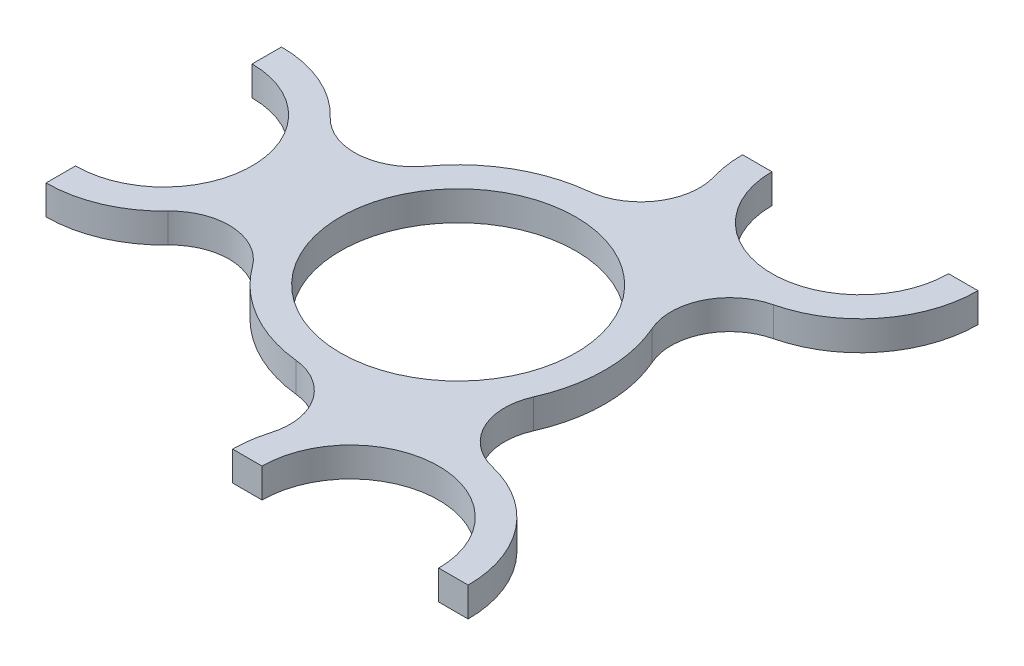
ISO-10303-21;
HEADER;
FILE_DESCRIPTION(('STEP AP214'),'2;1');
FILE_NAME('part.step','',(''),(''),'','','');
FILE_SCHEMA(('AUTOMOTIVE_DESIGN { 1 0 10303 214 1 1 1 1 }'));
ENDSEC;
DATA;
#1=APPLICATION_CONTEXT('core data for automotive mechanical design processes');
#2=APPLICATION_PROTOCOL_DEFINITION('international standard','automotive_design',2000,#1);
#3=PRODUCT_CONTEXT('',#1,'mechanical');
#4=PRODUCT('Part','Part','',(#3));
#5=PRODUCT_RELATED_PRODUCT_CATEGORY('part','',(#4));
#6=PRODUCT_DEFINITION_FORMATION('','',#4);
#7=PRODUCT_DEFINITION_CONTEXT('part definition',#1,'design');
#8=PRODUCT_DEFINITION('design','',#6,#7);
#9=PRODUCT_DEFINITION_SHAPE('','',#8);
#10=(LENGTH_UNIT() NAMED_UNIT(*) SI_UNIT(.MILLI.,.METRE.));
#11=(NAMED_UNIT(*) PLANE_ANGLE_UNIT() SI_UNIT($,.RADIAN.));
#12=(NAMED_UNIT(*) SI_UNIT($,.STERADIAN.) SOLID_ANGLE_UNIT());
#13=UNCERTAINTY_MEASURE_WITH_UNIT(LENGTH_MEASURE(1.E-05),#10,'distance_accuracy_value','');
#14=(GEOMETRIC_REPRESENTATION_CONTEXT(3) GLOBAL_UNCERTAINTY_ASSIGNED_CONTEXT((#13)) GLOBAL_UNIT_ASSIGNED_CONTEXT((#10,
#11,#12)) REPRESENTATION_CONTEXT('',''));
#15=CARTESIAN_POINT('',(0.,0.,0.));
#16=DIRECTION('',(0.,0.,1.));
#17=DIRECTION('',(1.,0.,0.));
#18=AXIS2_PLACEMENT_3D('',#15,#16,#17);
#19=CARTESIAN_POINT('',(50.,10.,-86.6));
#20=DIRECTION('',(0.,1.,0.));
#21=DIRECTION('',(0.,0.,1.));
#22=AXIS2_PLACEMENT_3D('',#19,#20,#21);
#23=PLANE('',#22);
#24=CARTESIAN_POINT('',(50.,10.,-86.6));
#25=DIRECTION('',(0.,1.,0.));
#26=DIRECTION('',(0.,0.,1.));
#27=AXIS2_PLACEMENT_3D('',#24,#25,#26);
#28=CIRCLE('',#27,40.);
#29=CARTESIAN_POINT('',(10.,10.,-86.6));
#30=VERTEX_POINT('',#29);
#31=CARTESIAN_POINT('',(11.6405543302781,10.,-75.2618816414869));
#32=VERTEX_POINT('',#31);
#33=EDGE_CURVE('E308',#30,#32,#28,.T.);
#34=ORIENTED_EDGE('',*,*,#33,.T.);
#35=CARTESIAN_POINT('',(-7.53916850458287,10.,-69.5928224622303));
#36=DIRECTION('',(0.,-1.,0.));
#37=DIRECTION('',(0.,0.,1.));
#38=AXIS2_PLACEMENT_3D('',#35,#36,#37);
#39=CIRCLE('',#38,20.);
#40=CARTESIAN_POINT('',(-5.38512036041633,10.,-49.7091589015931));
#41=VERTEX_POINT('',#40);
#42=EDGE_CURVE('E148',#32,#41,#39,.T.);
#43=ORIENTED_EDGE('',*,*,#42,.T.);
#44=CARTESIAN_POINT('',(0.,10.,0.));
#45=DIRECTION('',(0.,1.,0.));
#46=DIRECTION('',(0.,0.,1.));
#47=AXIS2_PLACEMENT_3D('',#44,#45,#46);
#48=CIRCLE('',#47,50.);
#49=CARTESIAN_POINT('',(-40.3571428571429,10.,-29.5178085299055));
#50=VERTEX_POINT('',#49);
#51=EDGE_CURVE('E393',#41,#50,#48,.T.);
#52=ORIENTED_EDGE('',*,*,#51,.T.);
#53=CARTESIAN_POINT('',(-56.5,10.,-41.3249319418677));
#54=DIRECTION('',(0.,-1.,0.));
#55=DIRECTION('',(0.,0.,1.));
#56=AXIS2_PLACEMENT_3D('',#53,#54,#55);
#57=CIRCLE('',#56,20.);
#58=CARTESIAN_POINT('',(-71.,10.,-27.5499546279118));
#59=VERTEX_POINT('',#58);
#60=EDGE_CURVE('E413',#50,#59,#57,.T.);
#61=ORIENTED_EDGE('',*,*,#60,.T.);
#62=CARTESIAN_POINT('',(-100.,10.,0.));
#63=DIRECTION('',(0.,1.,0.));
#64=DIRECTION('',(0.,0.,1.));
#65=AXIS2_PLACEMENT_3D('',#62,#63,#64);
#66=CIRCLE('',#65,40.);
#67=CARTESIAN_POINT('',(-100.,10.,-40.));
#68=VERTEX_POINT('',#67);
#69=EDGE_CURVE('E409',#59,#68,#66,.T.);
#70=ORIENTED_EDGE('',*,*,#69,.T.);
#71=DIRECTION('',(0.,0.,1.));
#72=VECTOR('',#71,1.);
#73=CARTESIAN_POINT('',(-100.,10.,-40.));
#74=LINE('',#73,#72);
#75=CARTESIAN_POINT('',(-100.,10.,-30.));
#76=VERTEX_POINT('',#75);
#77=EDGE_CURVE('E412',#68,#76,#74,.T.);
#78=ORIENTED_EDGE('',*,*,#77,.T.);
#79=CARTESIAN_POINT('',(-100.,10.,0.));
#80=DIRECTION('',(0.,-1.,0.));
#81=DIRECTION('',(0.,0.,1.));
#82=AXIS2_PLACEMENT_3D('',#79,#80,#81);
#83=CIRCLE('',#82,30.);
#84=CARTESIAN_POINT('',(-100.,10.,30.));
#85=VERTEX_POINT('',#84);
#86=EDGE_CURVE('E417',#76,#85,#83,.T.);
#87=ORIENTED_EDGE('',*,*,#86,.T.);
#88=DIRECTION('',(0.,0.,1.));
#89=VECTOR('',#88,1.);
#90=CARTESIAN_POINT('',(-100.,10.,30.));
#91=LINE('',#90,#89);
#92=CARTESIAN_POINT('',(-100.,10.,40.));
#93=VERTEX_POINT('',#92);
#94=EDGE_CURVE('E424',#85,#93,#91,.T.);
#95=ORIENTED_EDGE('',*,*,#94,.T.);
#96=CARTESIAN_POINT('',(-100.,10.,0.));
#97=DIRECTION('',(0.,1.,0.));
#98=DIRECTION('',(0.,0.,1.));
#99=AXIS2_PLACEMENT_3D('',#96,#97,#98);
#100=CIRCLE('',#99,40.);
#101=CARTESIAN_POINT('',(-71.,10.,27.5499546279118));
#102=VERTEX_POINT('',#101);
#103=EDGE_CURVE('E427',#93,#102,#100,.T.);
#104=ORIENTED_EDGE('',*,*,#103,.T.);
#105=CARTESIAN_POINT('',(-56.5,10.,41.3249319418677));
#106=DIRECTION('',(0.,-1.,0.));
#107=DIRECTION('',(0.,0.,-1.));
#108=AXIS2_PLACEMENT_3D('',#105,#106,#107);
#109=CIRCLE('',#108,20.);
#110=CARTESIAN_POINT('',(-40.3571428571428,10.,29.5178085299055));
#111=VERTEX_POINT('',#110);
#112=EDGE_CURVE('E430',#102,#111,#109,.T.);
#113=ORIENTED_EDGE('',*,*,#112,.T.);
#114=CARTESIAN_POINT('',(0.,10.,0.));
#115=DIRECTION('',(0.,1.,0.));
#116=DIRECTION('',(0.,0.,1.));
#117=AXIS2_PLACEMENT_3D('',#114,#115,#116);
#118=CIRCLE('',#117,50.);
#119=CARTESIAN_POINT('',(-5.38512036041633,10.,49.7091589015931));
#120=VERTEX_POINT('',#119);
#121=EDGE_CURVE('E433',#111,#120,#118,.T.);
#122=ORIENTED_EDGE('',*,*,#121,.T.);
#123=CARTESIAN_POINT('',(-7.53916850458286,10.,69.5928224622303));
#124=DIRECTION('',(0.,-1.,0.));
#125=DIRECTION('',(0.,0.,-1.));
#126=AXIS2_PLACEMENT_3D('',#123,#124,#125);
#127=CIRCLE('',#126,20.);
#128=CARTESIAN_POINT('',(11.6405543302781,10.,75.2618816414869));
#129=VERTEX_POINT('',#128);
#130=EDGE_CURVE('E436',#120,#129,#127,.T.);
#131=ORIENTED_EDGE('',*,*,#130,.T.);
#132=CARTESIAN_POINT('',(50.,10.,86.6));
#133=DIRECTION('',(0.,1.,0.));
#134=DIRECTION('',(0.,0.,-1.));
#135=AXIS2_PLACEMENT_3D('',#132,#133,#134);
#136=CIRCLE('',#135,40.);
#137=CARTESIAN_POINT('',(10.,10.,86.6));
#138=VERTEX_POINT('',#137);
#139=EDGE_CURVE('E439',#129,#138,#136,.T.);
#140=ORIENTED_EDGE('',*,*,#139,.T.);
#141=DIRECTION('',(1.,0.,0.));
#142=VECTOR('',#141,1.);
#143=CARTESIAN_POINT('',(10.,10.,86.6));
#144=LINE('',#143,#142);
#145=CARTESIAN_POINT('',(20.,10.,86.6));
#146=VERTEX_POINT('',#145);
#147=EDGE_CURVE('E442',#138,#146,#144,.T.);
#148=ORIENTED_EDGE('',*,*,#147,.T.);
#149=CARTESIAN_POINT('',(50.,10.,86.6));
#150=DIRECTION('',(0.,-1.,0.));
#151=DIRECTION('',(0.,0.,-1.));
#152=AXIS2_PLACEMENT_3D('',#149,#150,#151);
#153=CIRCLE('',#152,30.);
#154=CARTESIAN_POINT('',(80.,10.,86.6));
#155=VERTEX_POINT('',#154);
#156=EDGE_CURVE('E445',#146,#155,#153,.T.);
#157=ORIENTED_EDGE('',*,*,#156,.T.);
#158=DIRECTION('',(1.,0.,0.));
#159=VECTOR('',#158,1.);
#160=CARTESIAN_POINT('',(80.,10.,86.6));
#161=LINE('',#160,#159);
#162=CARTESIAN_POINT('',(90.,10.,86.6));
#163=VERTEX_POINT('',#162);
#164=EDGE_CURVE('E448',#155,#163,#161,.T.);
#165=ORIENTED_EDGE('',*,*,#164,.T.);
#166=CARTESIAN_POINT('',(50.,10.,86.6));
#167=DIRECTION('',(0.,1.,0.));
#168=DIRECTION('',(0.,0.,-1.));
#169=AXIS2_PLACEMENT_3D('',#166,#167,#168);
#170=CIRCLE('',#169,40.);
#171=CARTESIAN_POINT('',(59.3596363447783,10.,47.7104486077107));
#172=VERTEX_POINT('',#171);
#173=EDGE_CURVE('E451',#163,#172,#170,.T.);
#174=ORIENTED_EDGE('',*,*,#173,.T.);
#175=CARTESIAN_POINT('',(64.0394545171674,10.,28.2656729115661));
#176=DIRECTION('',(0.,-1.,0.));
#177=DIRECTION('',(0.,0.,-1.));
#178=AXIS2_PLACEMENT_3D('',#175,#176,#177);
#179=CIRCLE('',#178,20.);
#180=CARTESIAN_POINT('',(45.7424675122625,10.,20.1897663654044));
#181=VERTEX_POINT('',#180);
#182=EDGE_CURVE('E454',#172,#181,#179,.T.);
#183=ORIENTED_EDGE('',*,*,#182,.T.);
#184=CARTESIAN_POINT('',(0.,10.,0.));
#185=DIRECTION('',(0.,1.,0.));
#186=DIRECTION('',(0.,0.,1.));
#187=AXIS2_PLACEMENT_3D('',#184,#185,#186);
#188=CIRCLE('',#187,50.);
#189=CARTESIAN_POINT('',(45.7424675122625,10.,-20.1897663654044));
#190=VERTEX_POINT('',#189);
#191=EDGE_CURVE('E457',#181,#190,#188,.T.);
#192=ORIENTED_EDGE('',*,*,#191,.T.);
#193=CARTESIAN_POINT('',(64.0394545171674,10.,-28.2656729115661));
#194=DIRECTION('',(0.,-1.,0.));
#195=DIRECTION('',(0.,0.,1.));
#196=AXIS2_PLACEMENT_3D('',#193,#194,#195);
#197=CIRCLE('',#196,20.);
#198=CARTESIAN_POINT('',(59.3596363447783,10.,-47.7104486077108));
#199=VERTEX_POINT('',#198);
#200=EDGE_CURVE('E460',#190,#199,#197,.T.);
#201=ORIENTED_EDGE('',*,*,#200,.T.);
#202=CARTESIAN_POINT('',(50.,10.,-86.6));
#203=DIRECTION('',(0.,1.,0.));
#204=DIRECTION('',(0.,0.,1.));
#205=AXIS2_PLACEMENT_3D('',#202,#203,#204);
#206=CIRCLE('',#205,40.);
#207=CARTESIAN_POINT('',(90.,10.,-86.6));
#208=VERTEX_POINT('',#207);
#209=EDGE_CURVE('E215',#199,#208,#206,.T.);
#210=ORIENTED_EDGE('',*,*,#209,.T.);
#211=DIRECTION('',(-1.,0.,0.));
#212=VECTOR('',#211,1.);
#213=CARTESIAN_POINT('',(80.,10.,-86.6));
#214=LINE('',#213,#212);
#215=CARTESIAN_POINT('',(80.,10.,-86.6));
#216=VERTEX_POINT('',#215);
#217=EDGE_CURVE('E209',#208,#216,#214,.T.);
#218=ORIENTED_EDGE('',*,*,#217,.T.);
#219=CARTESIAN_POINT('',(50.,10.,-86.6));
#220=DIRECTION('',(0.,-1.,0.));
#221=DIRECTION('',(0.,0.,1.));
#222=AXIS2_PLACEMENT_3D('',#219,#220,#221);
#223=CIRCLE('',#222,30.);
#224=CARTESIAN_POINT('',(20.,10.,-86.6));
#225=VERTEX_POINT('',#224);
#226=EDGE_CURVE('E213',#216,#225,#223,.T.);
#227=ORIENTED_EDGE('',*,*,#226,.T.);
#228=DIRECTION('',(-1.,0.,0.));
#229=VECTOR('',#228,1.);
#230=CARTESIAN_POINT('',(10.,10.,-86.6));
#231=LINE('',#230,#229);
#232=EDGE_CURVE('E57',#225,#30,#231,.T.);
#233=ORIENTED_EDGE('',*,*,#232,.T.);
#234=EDGE_LOOP('',(#34,#43,#52,#61,#70,#78,#87,#95,#104,#113,#122,#131,#140,#148,#157,#165,#174,
#183,#192,#201,#210,#218,#227,#233));
#235=FACE_BOUND('',#234,.T.);
#236=CARTESIAN_POINT('',(0.,10.,0.));
#237=DIRECTION('',(0.,1.,0.));
#238=DIRECTION('',(0.,0.,1.));
#239=AXIS2_PLACEMENT_3D('',#236,#237,#238);
#240=CIRCLE('',#239,40.);
#241=CARTESIAN_POINT('',(0.,10.,40.));
#242=VERTEX_POINT('',#241);
#243=EDGE_CURVE('E242',#242,#242,#240,.T.);
#244=ORIENTED_EDGE('',*,*,#243,.F.);
#245=EDGE_LOOP('',(#244));
#246=FACE_BOUND('',#245,.T.);
#247=ADVANCED_FACE('F39',(#235,#246),#23,.T.);
#248=CARTESIAN_POINT('',(50.,0.,-86.6));
#249=DIRECTION('',(0.,1.,0.));
#250=DIRECTION('',(0.,0.,1.));
#251=AXIS2_PLACEMENT_3D('',#248,#249,#250);
#252=PLANE('',#251);
#253=CARTESIAN_POINT('',(50.,0.,-86.6));
#254=DIRECTION('',(0.,1.,0.));
#255=DIRECTION('',(0.,0.,1.));
#256=AXIS2_PLACEMENT_3D('',#253,#254,#255);
#257=CIRCLE('',#256,40.);
#258=CARTESIAN_POINT('',(10.,0.,-86.6));
#259=VERTEX_POINT('',#258);
#260=CARTESIAN_POINT('',(11.6405543302781,0.,-75.2618816414869));
#261=VERTEX_POINT('',#260);
#262=EDGE_CURVE('E237',#259,#261,#257,.T.);
#263=ORIENTED_EDGE('',*,*,#262,.F.);
#264=DIRECTION('',(-1.,0.,0.));
#265=VECTOR('',#264,1.);
#266=CARTESIAN_POINT('',(10.,0.,-86.6));
#267=LINE('',#266,#265);
#268=CARTESIAN_POINT('',(20.,0.,-86.6));
#269=VERTEX_POINT('',#268);
#270=EDGE_CURVE('E140',#269,#259,#267,.T.);
#271=ORIENTED_EDGE('',*,*,#270,.F.);
#272=CARTESIAN_POINT('',(50.,0.,-86.6));
#273=DIRECTION('',(0.,-1.,0.));
#274=DIRECTION('',(0.,0.,1.));
#275=AXIS2_PLACEMENT_3D('',#272,#273,#274);
#276=CIRCLE('',#275,30.);
#277=CARTESIAN_POINT('',(80.,0.,-86.6));
#278=VERTEX_POINT('',#277);
#279=EDGE_CURVE('E134',#278,#269,#276,.T.);
#280=ORIENTED_EDGE('',*,*,#279,.F.);
#281=DIRECTION('',(-1.,0.,0.));
#282=VECTOR('',#281,1.);
#283=CARTESIAN_POINT('',(80.,0.,-86.6));
#284=LINE('',#283,#282);
#285=CARTESIAN_POINT('',(90.,0.,-86.6));
#286=VERTEX_POINT('',#285);
#287=EDGE_CURVE('E224',#286,#278,#284,.T.);
#288=ORIENTED_EDGE('',*,*,#287,.F.);
#289=CARTESIAN_POINT('',(50.,0.,-86.6));
#290=DIRECTION('',(0.,1.,0.));
#291=DIRECTION('',(0.,0.,1.));
#292=AXIS2_PLACEMENT_3D('',#289,#290,#291);
#293=CIRCLE('',#292,40.);
#294=CARTESIAN_POINT('',(59.3596363447783,0.,-47.7104486077108));
#295=VERTEX_POINT('',#294);
#296=EDGE_CURVE('E299',#295,#286,#293,.T.);
#297=ORIENTED_EDGE('',*,*,#296,.F.);
#298=CARTESIAN_POINT('',(64.0394545171674,0.,-28.2656729115661));
#299=DIRECTION('',(0.,-1.,0.));
#300=DIRECTION('',(0.,0.,1.));
#301=AXIS2_PLACEMENT_3D('',#298,#299,#300);
#302=CIRCLE('',#301,20.);
#303=CARTESIAN_POINT('',(45.7424675122625,0.,-20.1897663654044));
#304=VERTEX_POINT('',#303);
#305=EDGE_CURVE('E296',#304,#295,#302,.T.);
#306=ORIENTED_EDGE('',*,*,#305,.F.);
#307=CARTESIAN_POINT('',(0.,0.,0.));
#308=DIRECTION('',(0.,1.,0.));
#309=DIRECTION('',(0.,0.,1.));
#310=AXIS2_PLACEMENT_3D('',#307,#308,#309);
#311=CIRCLE('',#310,50.);
#312=CARTESIAN_POINT('',(45.7424675122625,0.,20.1897663654044));
#313=VERTEX_POINT('',#312);
#314=EDGE_CURVE('E293',#313,#304,#311,.T.);
#315=ORIENTED_EDGE('',*,*,#314,.F.);
#316=CARTESIAN_POINT('',(64.0394545171674,0.,28.2656729115661));
#317=DIRECTION('',(0.,-1.,0.));
#318=DIRECTION('',(0.,0.,-1.));
#319=AXIS2_PLACEMENT_3D('',#316,#317,#318);
#320=CIRCLE('',#319,20.);
#321=CARTESIAN_POINT('',(59.3596363447783,0.,47.7104486077107));
#322=VERTEX_POINT('',#321);
#323=EDGE_CURVE('E290',#322,#313,#320,.T.);
#324=ORIENTED_EDGE('',*,*,#323,.F.);
#325=CARTESIAN_POINT('',(50.,0.,86.6));
#326=DIRECTION('',(0.,1.,0.));
#327=DIRECTION('',(0.,0.,-1.));
#328=AXIS2_PLACEMENT_3D('',#325,#326,#327);
#329=CIRCLE('',#328,40.);
#330=CARTESIAN_POINT('',(90.,0.,86.6));
#331=VERTEX_POINT('',#330);
#332=EDGE_CURVE('E287',#331,#322,#329,.T.);
#333=ORIENTED_EDGE('',*,*,#332,.F.);
#334=DIRECTION('',(1.,0.,0.));
#335=VECTOR('',#334,1.);
#336=CARTESIAN_POINT('',(80.,0.,86.6));
#337=LINE('',#336,#335);
#338=CARTESIAN_POINT('',(80.,0.,86.6));
#339=VERTEX_POINT('',#338);
#340=EDGE_CURVE('E284',#339,#331,#337,.T.);
#341=ORIENTED_EDGE('',*,*,#340,.F.);
#342=CARTESIAN_POINT('',(50.,0.,86.6));
#343=DIRECTION('',(0.,-1.,0.));
#344=DIRECTION('',(0.,0.,-1.));
#345=AXIS2_PLACEMENT_3D('',#342,#343,#344);
#346=CIRCLE('',#345,30.);
#347=CARTESIAN_POINT('',(20.,0.,86.6));
#348=VERTEX_POINT('',#347);
#349=EDGE_CURVE('E281',#348,#339,#346,.T.);
#350=ORIENTED_EDGE('',*,*,#349,.F.);
#351=DIRECTION('',(1.,0.,0.));
#352=VECTOR('',#351,1.);
#353=CARTESIAN_POINT('',(10.,0.,86.6));
#354=LINE('',#353,#352);
#355=CARTESIAN_POINT('',(10.,0.,86.6));
#356=VERTEX_POINT('',#355);
#357=EDGE_CURVE('E278',#356,#348,#354,.T.);
#358=ORIENTED_EDGE('',*,*,#357,.F.);
#359=CARTESIAN_POINT('',(50.,0.,86.6));
#360=DIRECTION('',(0.,1.,0.));
#361=DIRECTION('',(0.,0.,-1.));
#362=AXIS2_PLACEMENT_3D('',#359,#360,#361);
#363=CIRCLE('',#362,40.);
#364=CARTESIAN_POINT('',(11.6405543302781,0.,75.2618816414869));
#365=VERTEX_POINT('',#364);
#366=EDGE_CURVE('E275',#365,#356,#363,.T.);
#367=ORIENTED_EDGE('',*,*,#366,.F.);
#368=CARTESIAN_POINT('',(-7.53916850458286,0.,69.5928224622303));
#369=DIRECTION('',(0.,-1.,0.));
#370=DIRECTION('',(0.,0.,-1.));
#371=AXIS2_PLACEMENT_3D('',#368,#369,#370);
#372=CIRCLE('',#371,20.);
#373=CARTESIAN_POINT('',(-5.38512036041633,0.,49.7091589015931));
#374=VERTEX_POINT('',#373);
#375=EDGE_CURVE('E272',#374,#365,#372,.T.);
#376=ORIENTED_EDGE('',*,*,#375,.F.);
#377=CARTESIAN_POINT('',(0.,0.,0.));
#378=DIRECTION('',(0.,1.,0.));
#379=DIRECTION('',(0.,0.,1.));
#380=AXIS2_PLACEMENT_3D('',#377,#378,#379);
#381=CIRCLE('',#380,50.);
#382=CARTESIAN_POINT('',(-40.3571428571428,0.,29.5178085299055));
#383=VERTEX_POINT('',#382);
#384=EDGE_CURVE('E269',#383,#374,#381,.T.);
#385=ORIENTED_EDGE('',*,*,#384,.F.);
#386=CARTESIAN_POINT('',(-56.5,0.,41.3249319418677));
#387=DIRECTION('',(0.,-1.,0.));
#388=DIRECTION('',(0.,0.,-1.));
#389=AXIS2_PLACEMENT_3D('',#386,#387,#388);
#390=CIRCLE('',#389,20.);
#391=CARTESIAN_POINT('',(-71.,0.,27.5499546279118));
#392=VERTEX_POINT('',#391);
#393=EDGE_CURVE('E266',#392,#383,#390,.T.);
#394=ORIENTED_EDGE('',*,*,#393,.F.);
#395=CARTESIAN_POINT('',(-100.,0.,0.));
#396=DIRECTION('',(0.,1.,0.));
#397=DIRECTION('',(0.,0.,1.));
#398=AXIS2_PLACEMENT_3D('',#395,#396,#397);
#399=CIRCLE('',#398,40.);
#400=CARTESIAN_POINT('',(-100.,0.,40.));
#401=VERTEX_POINT('',#400);
#402=EDGE_CURVE('E263',#401,#392,#399,.T.);
#403=ORIENTED_EDGE('',*,*,#402,.F.);
#404=DIRECTION('',(0.,0.,1.));
#405=VECTOR('',#404,1.);
#406=CARTESIAN_POINT('',(-100.,0.,30.));
#407=LINE('',#406,#405);
#408=CARTESIAN_POINT('',(-100.,0.,30.));
#409=VERTEX_POINT('',#408);
#410=EDGE_CURVE('E260',#409,#401,#407,.T.);
#411=ORIENTED_EDGE('',*,*,#410,.F.);
#412=CARTESIAN_POINT('',(-100.,0.,0.));
#413=DIRECTION('',(0.,-1.,0.));
#414=DIRECTION('',(0.,0.,1.));
#415=AXIS2_PLACEMENT_3D('',#412,#413,#414);
#416=CIRCLE('',#415,30.);
#417=CARTESIAN_POINT('',(-100.,0.,-30.));
#418=VERTEX_POINT('',#417);
#419=EDGE_CURVE('E257',#418,#409,#416,.T.);
#420=ORIENTED_EDGE('',*,*,#419,.F.);
#421=DIRECTION('',(0.,0.,1.));
#422=VECTOR('',#421,1.);
#423=CARTESIAN_POINT('',(-100.,0.,-40.));
#424=LINE('',#423,#422);
#425=CARTESIAN_POINT('',(-100.,0.,-40.));
#426=VERTEX_POINT('',#425);
#427=EDGE_CURVE('E254',#426,#418,#424,.T.);
#428=ORIENTED_EDGE('',*,*,#427,.F.);
#429=CARTESIAN_POINT('',(-100.,0.,0.));
#430=DIRECTION('',(0.,1.,0.));
#431=DIRECTION('',(0.,0.,1.));
#432=AXIS2_PLACEMENT_3D('',#429,#430,#431);
#433=CIRCLE('',#432,40.);
#434=CARTESIAN_POINT('',(-71.,0.,-27.5499546279118));
#435=VERTEX_POINT('',#434);
#436=EDGE_CURVE('E251',#435,#426,#433,.T.);
#437=ORIENTED_EDGE('',*,*,#436,.F.);
#438=CARTESIAN_POINT('',(-56.5,0.,-41.3249319418677));
#439=DIRECTION('',(0.,-1.,0.));
#440=DIRECTION('',(0.,0.,1.));
#441=AXIS2_PLACEMENT_3D('',#438,#439,#440);
#442=CIRCLE('',#441,20.);
#443=CARTESIAN_POINT('',(-40.3571428571429,0.,-29.5178085299055));
#444=VERTEX_POINT('',#443);
#445=EDGE_CURVE('E248',#444,#435,#442,.T.);
#446=ORIENTED_EDGE('',*,*,#445,.F.);
#447=CARTESIAN_POINT('',(0.,0.,0.));
#448=DIRECTION('',(0.,1.,0.));
#449=DIRECTION('',(0.,0.,1.));
#450=AXIS2_PLACEMENT_3D('',#447,#448,#449);
#451=CIRCLE('',#450,50.);
#452=CARTESIAN_POINT('',(-5.38512036041633,0.,-49.7091589015931));
#453=VERTEX_POINT('',#452);
#454=EDGE_CURVE('E245',#453,#444,#451,.T.);
#455=ORIENTED_EDGE('',*,*,#454,.F.);
#456=CARTESIAN_POINT('',(-7.53916850458287,0.,-69.5928224622303));
#457=DIRECTION('',(0.,-1.,0.));
#458=DIRECTION('',(0.,0.,1.));
#459=AXIS2_PLACEMENT_3D('',#456,#457,#458);
#460=CIRCLE('',#459,20.);
#461=EDGE_CURVE('E241',#261,#453,#460,.T.);
#462=ORIENTED_EDGE('',*,*,#461,.F.);
#463=EDGE_LOOP('',(#263,#271,#280,#288,#297,#306,#315,#324,#333,#341,#350,#358,#367,#376,#385,
#394,#403,#411,#420,#428,#437,#446,#455,#462));
#464=FACE_BOUND('',#463,.T.);
#465=CARTESIAN_POINT('',(0.,0.,0.));
#466=DIRECTION('',(0.,1.,0.));
#467=DIRECTION('',(0.,0.,1.));
#468=AXIS2_PLACEMENT_3D('',#465,#466,#467);
#469=CIRCLE('',#468,40.);
#470=CARTESIAN_POINT('',(0.,0.,40.));
#471=VERTEX_POINT('',#470);
#472=EDGE_CURVE('E765',#471,#471,#469,.T.);
#473=ORIENTED_EDGE('',*,*,#472,.T.);
#474=EDGE_LOOP('',(#473));
#475=FACE_BOUND('',#474,.T.);
#476=ADVANCED_FACE('F397',(#464,#475),#252,.F.);
#477=CARTESIAN_POINT('',(50.,10.,-86.6));
#478=DIRECTION('',(0.,-1.,0.));
#479=DIRECTION('',(0.,0.,-1.));
#480=AXIS2_PLACEMENT_3D('',#477,#478,#479);
#481=CYLINDRICAL_SURFACE('',#480,40.);
#482=ORIENTED_EDGE('',*,*,#262,.T.);
#483=DIRECTION('',(0.,-1.,0.));
#484=VECTOR('',#483,1.);
#485=CARTESIAN_POINT('',(11.6405543302781,10.,-75.2618816414869));
#486=LINE('',#485,#484);
#487=EDGE_CURVE('E11',#32,#261,#486,.T.);
#488=ORIENTED_EDGE('',*,*,#487,.F.);
#489=ORIENTED_EDGE('',*,*,#33,.F.);
#490=DIRECTION('',(0.,-1.,0.));
#491=VECTOR('',#490,1.);
#492=CARTESIAN_POINT('',(10.,10.,-86.6));
#493=LINE('',#492,#491);
#494=EDGE_CURVE('E233',#30,#259,#493,.T.);
#495=ORIENTED_EDGE('',*,*,#494,.T.);
#496=EDGE_LOOP('',(#482,#488,#489,#495));
#497=FACE_BOUND('',#496,.T.);
#498=ADVANCED_FACE('F41',(#497),#481,.T.);
#499=CARTESIAN_POINT('',(-7.53916850458287,10.,-69.5928224622303));
#500=DIRECTION('',(0.,-1.,0.));
#501=DIRECTION('',(0.,0.,-1.));
#502=AXIS2_PLACEMENT_3D('',#499,#500,#501);
#503=CYLINDRICAL_SURFACE('',#502,20.);
#504=ORIENTED_EDGE('',*,*,#461,.T.);
#505=DIRECTION('',(0.,-1.,0.));
#506=VECTOR('',#505,1.);
#507=CARTESIAN_POINT('',(-5.38512036041633,10.,-49.7091589015931));
#508=LINE('',#507,#506);
#509=EDGE_CURVE('E49',#41,#453,#508,.T.);
#510=ORIENTED_EDGE('',*,*,#509,.F.);
#511=ORIENTED_EDGE('',*,*,#42,.F.);
#512=ORIENTED_EDGE('',*,*,#487,.T.);
#513=EDGE_LOOP('',(#504,#510,#511,#512));
#514=FACE_BOUND('',#513,.T.);
#515=ADVANCED_FACE('F496',(#514),#503,.F.);
#516=CARTESIAN_POINT('',(0.,10.,0.));
#517=DIRECTION('',(0.,-1.,0.));
#518=DIRECTION('',(0.,0.,-1.));
#519=AXIS2_PLACEMENT_3D('',#516,#517,#518);
#520=CYLINDRICAL_SURFACE('',#519,50.);
#521=ORIENTED_EDGE('',*,*,#454,.T.);
#522=DIRECTION('',(0.,-1.,0.));
#523=VECTOR('',#522,1.);
#524=CARTESIAN_POINT('',(-40.3571428571429,10.,-29.5178085299055));
#525=LINE('',#524,#523);
#526=EDGE_CURVE('E383',#50,#444,#525,.T.);
#527=ORIENTED_EDGE('',*,*,#526,.F.);
#528=ORIENTED_EDGE('',*,*,#51,.F.);
#529=ORIENTED_EDGE('',*,*,#509,.T.);
#530=EDGE_LOOP('',(#521,#527,#528,#529));
#531=FACE_BOUND('',#530,.T.);
#532=ADVANCED_FACE('F391',(#531),#520,.T.);
#533=CARTESIAN_POINT('',(-56.5,10.,-41.3249319418677));
#534=DIRECTION('',(0.,-1.,0.));
#535=DIRECTION('',(0.,0.,-1.));
#536=AXIS2_PLACEMENT_3D('',#533,#534,#535);
#537=CYLINDRICAL_SURFACE('',#536,20.);
#538=ORIENTED_EDGE('',*,*,#445,.T.);
#539=DIRECTION('',(0.,-1.,0.));
#540=VECTOR('',#539,1.);
#541=CARTESIAN_POINT('',(-71.,10.,-27.5499546279118));
#542=LINE('',#541,#540);
#543=EDGE_CURVE('E379',#59,#435,#542,.T.);
#544=ORIENTED_EDGE('',*,*,#543,.F.);
#545=ORIENTED_EDGE('',*,*,#60,.F.);
#546=ORIENTED_EDGE('',*,*,#526,.T.);
#547=EDGE_LOOP('',(#538,#544,#545,#546));
#548=FACE_BOUND('',#547,.T.);
#549=ADVANCED_FACE('F403',(#548),#537,.F.);
#550=CARTESIAN_POINT('',(-100.,10.,0.));
#551=DIRECTION('',(0.,-1.,0.));
#552=DIRECTION('',(0.,0.,-1.));
#553=AXIS2_PLACEMENT_3D('',#550,#551,#552);
#554=CYLINDRICAL_SURFACE('',#553,40.);
#555=ORIENTED_EDGE('',*,*,#436,.T.);
#556=DIRECTION('',(0.,-1.,0.));
#557=VECTOR('',#556,1.);
#558=CARTESIAN_POINT('',(-100.,10.,-40.));
#559=LINE('',#558,#557);
#560=EDGE_CURVE('E375',#68,#426,#559,.T.);
#561=ORIENTED_EDGE('',*,*,#560,.F.);
#562=ORIENTED_EDGE('',*,*,#69,.F.);
#563=ORIENTED_EDGE('',*,*,#543,.T.);
#564=EDGE_LOOP('',(#555,#561,#562,#563));
#565=FACE_BOUND('',#564,.T.);
#566=ADVANCED_FACE('F407',(#565),#554,.T.);
#567=CARTESIAN_POINT('',(-100.,10.,-40.));
#568=DIRECTION('',(1.,0.,0.));
#569=DIRECTION('',(0.,0.,-1.));
#570=AXIS2_PLACEMENT_3D('',#567,#568,#569);
#571=PLANE('',#570);
#572=ORIENTED_EDGE('',*,*,#427,.T.);
#573=DIRECTION('',(0.,-1.,0.));
#574=VECTOR('',#573,1.);
#575=CARTESIAN_POINT('',(-100.,10.,-30.));
#576=LINE('',#575,#574);
#577=EDGE_CURVE('E371',#76,#418,#576,.T.);
#578=ORIENTED_EDGE('',*,*,#577,.F.);
#579=ORIENTED_EDGE('',*,*,#77,.F.);
#580=ORIENTED_EDGE('',*,*,#560,.T.);
#581=EDGE_LOOP('',(#572,#578,#579,#580));
#582=FACE_BOUND('',#581,.T.);
#583=ADVANCED_FACE('F509',(#582),#571,.F.);
#584=CARTESIAN_POINT('',(-100.,10.,0.));
#585=DIRECTION('',(0.,-1.,0.));
#586=DIRECTION('',(0.,0.,-1.));
#587=AXIS2_PLACEMENT_3D('',#584,#585,#586);
#588=CYLINDRICAL_SURFACE('',#587,30.);
#589=ORIENTED_EDGE('',*,*,#419,.T.);
#590=DIRECTION('',(0.,-1.,0.));
#591=VECTOR('',#590,1.);
#592=CARTESIAN_POINT('',(-100.,10.,30.));
#593=LINE('',#592,#591);
#594=EDGE_CURVE('E367',#85,#409,#593,.T.);
#595=ORIENTED_EDGE('',*,*,#594,.F.);
#596=ORIENTED_EDGE('',*,*,#86,.F.);
#597=ORIENTED_EDGE('',*,*,#577,.T.);
#598=EDGE_LOOP('',(#589,#595,#596,#597));
#599=FACE_BOUND('',#598,.T.);
#600=ADVANCED_FACE('F512',(#599),#588,.F.);
#601=CARTESIAN_POINT('',(-100.,10.,30.));
#602=DIRECTION('',(1.,0.,0.));
#603=DIRECTION('',(0.,0.,-1.));
#604=AXIS2_PLACEMENT_3D('',#601,#602,#603);
#605=PLANE('',#604);
#606=ORIENTED_EDGE('',*,*,#410,.T.);
#607=DIRECTION('',(0.,-1.,0.));
#608=VECTOR('',#607,1.);
#609=CARTESIAN_POINT('',(-100.,10.,40.));
#610=LINE('',#609,#608);
#611=EDGE_CURVE('E363',#93,#401,#610,.T.);
#612=ORIENTED_EDGE('',*,*,#611,.F.);
#613=ORIENTED_EDGE('',*,*,#94,.F.);
#614=ORIENTED_EDGE('',*,*,#594,.T.);
#615=EDGE_LOOP('',(#606,#612,#613,#614));
#616=FACE_BOUND('',#615,.T.);
#617=ADVANCED_FACE('F516',(#616),#605,.F.);
#618=CARTESIAN_POINT('',(-100.,10.,0.));
#619=DIRECTION('',(0.,-1.,0.));
#620=DIRECTION('',(0.,0.,-1.));
#621=AXIS2_PLACEMENT_3D('',#618,#619,#620);
#622=CYLINDRICAL_SURFACE('',#621,40.);
#623=ORIENTED_EDGE('',*,*,#402,.T.);
#624=DIRECTION('',(0.,-1.,0.));
#625=VECTOR('',#624,1.);
#626=CARTESIAN_POINT('',(-71.,10.,27.5499546279118));
#627=LINE('',#626,#625);
#628=EDGE_CURVE('E359',#102,#392,#627,.T.);
#629=ORIENTED_EDGE('',*,*,#628,.F.);
#630=ORIENTED_EDGE('',*,*,#103,.F.);
#631=ORIENTED_EDGE('',*,*,#611,.T.);
#632=EDGE_LOOP('',(#623,#629,#630,#631));
#633=FACE_BOUND('',#632,.T.);
#634=ADVANCED_FACE('F520',(#633),#622,.T.);
#635=CARTESIAN_POINT('',(-56.5,10.,41.3249319418677));
#636=DIRECTION('',(0.,-1.,0.));
#637=DIRECTION('',(0.,0.,-1.));
#638=AXIS2_PLACEMENT_3D('',#635,#636,#637);
#639=CYLINDRICAL_SURFACE('',#638,20.);
#640=ORIENTED_EDGE('',*,*,#393,.T.);
#641=DIRECTION('',(0.,-1.,0.));
#642=VECTOR('',#641,1.);
#643=CARTESIAN_POINT('',(-40.3571428571428,10.,29.5178085299055));
#644=LINE('',#643,#642);
#645=EDGE_CURVE('E355',#111,#383,#644,.T.);
#646=ORIENTED_EDGE('',*,*,#645,.F.);
#647=ORIENTED_EDGE('',*,*,#112,.F.);
#648=ORIENTED_EDGE('',*,*,#628,.T.);
#649=EDGE_LOOP('',(#640,#646,#647,#648));
#650=FACE_BOUND('',#649,.T.);
#651=ADVANCED_FACE('F524',(#650),#639,.F.);
#652=CARTESIAN_POINT('',(0.,10.,0.));
#653=DIRECTION('',(0.,-1.,0.));
#654=DIRECTION('',(0.,0.,-1.));
#655=AXIS2_PLACEMENT_3D('',#652,#653,#654);
#656=CYLINDRICAL_SURFACE('',#655,50.);
#657=ORIENTED_EDGE('',*,*,#384,.T.);
#658=DIRECTION('',(0.,-1.,0.));
#659=VECTOR('',#658,1.);
#660=CARTESIAN_POINT('',(-5.38512036041633,10.,49.7091589015931));
#661=LINE('',#660,#659);
#662=EDGE_CURVE('E351',#120,#374,#661,.T.);
#663=ORIENTED_EDGE('',*,*,#662,.F.);
#664=ORIENTED_EDGE('',*,*,#121,.F.);
#665=ORIENTED_EDGE('',*,*,#645,.T.);
#666=EDGE_LOOP('',(#657,#663,#664,#665));
#667=FACE_BOUND('',#666,.T.);
#668=ADVANCED_FACE('F528',(#667),#656,.T.);
#669=CARTESIAN_POINT('',(-7.53916850458286,10.,69.5928224622303));
#670=DIRECTION('',(0.,-1.,0.));
#671=DIRECTION('',(0.,0.,-1.));
#672=AXIS2_PLACEMENT_3D('',#669,#670,#671);
#673=CYLINDRICAL_SURFACE('',#672,20.);
#674=ORIENTED_EDGE('',*,*,#375,.T.);
#675=DIRECTION('',(0.,-1.,0.));
#676=VECTOR('',#675,1.);
#677=CARTESIAN_POINT('',(11.6405543302781,10.,75.2618816414869));
#678=LINE('',#677,#676);
#679=EDGE_CURVE('E347',#129,#365,#678,.T.);
#680=ORIENTED_EDGE('',*,*,#679,.F.);
#681=ORIENTED_EDGE('',*,*,#130,.F.);
#682=ORIENTED_EDGE('',*,*,#662,.T.);
#683=EDGE_LOOP('',(#674,#680,#681,#682));
#684=FACE_BOUND('',#683,.T.);
#685=ADVANCED_FACE('F532',(#684),#673,.F.);
#686=CARTESIAN_POINT('',(50.,10.,86.6));
#687=DIRECTION('',(0.,-1.,0.));
#688=DIRECTION('',(0.,0.,-1.));
#689=AXIS2_PLACEMENT_3D('',#686,#687,#688);
#690=CYLINDRICAL_SURFACE('',#689,40.);
#691=ORIENTED_EDGE('',*,*,#366,.T.);
#692=DIRECTION('',(0.,-1.,0.));
#693=VECTOR('',#692,1.);
#694=CARTESIAN_POINT('',(10.,10.,86.6));
#695=LINE('',#694,#693);
#696=EDGE_CURVE('E343',#138,#356,#695,.T.);
#697=ORIENTED_EDGE('',*,*,#696,.F.);
#698=ORIENTED_EDGE('',*,*,#139,.F.);
#699=ORIENTED_EDGE('',*,*,#679,.T.);
#700=EDGE_LOOP('',(#691,#697,#698,#699));
#701=FACE_BOUND('',#700,.T.);
#702=ADVANCED_FACE('F536',(#701),#690,.T.);
#703=CARTESIAN_POINT('',(10.,10.,86.6));
#704=DIRECTION('',(0.,0.,-1.));
#705=DIRECTION('',(-1.,0.,0.));
#706=AXIS2_PLACEMENT_3D('',#703,#704,#705);
#707=PLANE('',#706);
#708=ORIENTED_EDGE('',*,*,#357,.T.);
#709=DIRECTION('',(0.,-1.,0.));
#710=VECTOR('',#709,1.);
#711=CARTESIAN_POINT('',(20.,10.,86.6));
#712=LINE('',#711,#710);
#713=EDGE_CURVE('E339',#146,#348,#712,.T.);
#714=ORIENTED_EDGE('',*,*,#713,.F.);
#715=ORIENTED_EDGE('',*,*,#147,.F.);
#716=ORIENTED_EDGE('',*,*,#696,.T.);
#717=EDGE_LOOP('',(#708,#714,#715,#716));
#718=FACE_BOUND('',#717,.T.);
#719=ADVANCED_FACE('F540',(#718),#707,.F.);
#720=CARTESIAN_POINT('',(50.,10.,86.6));
#721=DIRECTION('',(0.,-1.,0.));
#722=DIRECTION('',(0.,0.,-1.));
#723=AXIS2_PLACEMENT_3D('',#720,#721,#722);
#724=CYLINDRICAL_SURFACE('',#723,30.);
#725=ORIENTED_EDGE('',*,*,#349,.T.);
#726=DIRECTION('',(0.,-1.,0.));
#727=VECTOR('',#726,1.);
#728=CARTESIAN_POINT('',(80.,10.,86.6));
#729=LINE('',#728,#727);
#730=EDGE_CURVE('E335',#155,#339,#729,.T.);
#731=ORIENTED_EDGE('',*,*,#730,.F.);
#732=ORIENTED_EDGE('',*,*,#156,.F.);
#733=ORIENTED_EDGE('',*,*,#713,.T.);
#734=EDGE_LOOP('',(#725,#731,#732,#733));
#735=FACE_BOUND('',#734,.T.);
#736=ADVANCED_FACE('F544',(#735),#724,.F.);
#737=CARTESIAN_POINT('',(80.,10.,86.6));
#738=DIRECTION('',(0.,0.,-1.));
#739=DIRECTION('',(-1.,0.,0.));
#740=AXIS2_PLACEMENT_3D('',#737,#738,#739);
#741=PLANE('',#740);
#742=ORIENTED_EDGE('',*,*,#340,.T.);
#743=DIRECTION('',(0.,-1.,0.));
#744=VECTOR('',#743,1.);
#745=CARTESIAN_POINT('',(90.,10.,86.6));
#746=LINE('',#745,#744);
#747=EDGE_CURVE('E331',#163,#331,#746,.T.);
#748=ORIENTED_EDGE('',*,*,#747,.F.);
#749=ORIENTED_EDGE('',*,*,#164,.F.);
#750=ORIENTED_EDGE('',*,*,#730,.T.);
#751=EDGE_LOOP('',(#742,#748,#749,#750));
#752=FACE_BOUND('',#751,.T.);
#753=ADVANCED_FACE('F548',(#752),#741,.F.);
#754=CARTESIAN_POINT('',(50.,10.,86.6));
#755=DIRECTION('',(0.,-1.,0.));
#756=DIRECTION('',(0.,0.,-1.));
#757=AXIS2_PLACEMENT_3D('',#754,#755,#756);
#758=CYLINDRICAL_SURFACE('',#757,40.);
#759=ORIENTED_EDGE('',*,*,#332,.T.);
#760=DIRECTION('',(0.,-1.,0.));
#761=VECTOR('',#760,1.);
#762=CARTESIAN_POINT('',(59.3596363447783,10.,47.7104486077107));
#763=LINE('',#762,#761);
#764=EDGE_CURVE('E327',#172,#322,#763,.T.);
#765=ORIENTED_EDGE('',*,*,#764,.F.);
#766=ORIENTED_EDGE('',*,*,#173,.F.);
#767=ORIENTED_EDGE('',*,*,#747,.T.);
#768=EDGE_LOOP('',(#759,#765,#766,#767));
#769=FACE_BOUND('',#768,.T.);
#770=ADVANCED_FACE('F552',(#769),#758,.T.);
#771=CARTESIAN_POINT('',(64.0394545171674,10.,28.2656729115661));
#772=DIRECTION('',(0.,-1.,0.));
#773=DIRECTION('',(0.,0.,-1.));
#774=AXIS2_PLACEMENT_3D('',#771,#772,#773);
#775=CYLINDRICAL_SURFACE('',#774,20.);
#776=ORIENTED_EDGE('',*,*,#323,.T.);
#777=DIRECTION('',(0.,-1.,0.));
#778=VECTOR('',#777,1.);
#779=CARTESIAN_POINT('',(45.7424675122625,10.,20.1897663654044));
#780=LINE('',#779,#778);
#781=EDGE_CURVE('E323',#181,#313,#780,.T.);
#782=ORIENTED_EDGE('',*,*,#781,.F.);
#783=ORIENTED_EDGE('',*,*,#182,.F.);
#784=ORIENTED_EDGE('',*,*,#764,.T.);
#785=EDGE_LOOP('',(#776,#782,#783,#784));
#786=FACE_BOUND('',#785,.T.);
#787=ADVANCED_FACE('F556',(#786),#775,.F.);
#788=CARTESIAN_POINT('',(0.,10.,0.));
#789=DIRECTION('',(0.,-1.,0.));
#790=DIRECTION('',(0.,0.,-1.));
#791=AXIS2_PLACEMENT_3D('',#788,#789,#790);
#792=CYLINDRICAL_SURFACE('',#791,50.);
#793=ORIENTED_EDGE('',*,*,#314,.T.);
#794=DIRECTION('',(0.,-1.,0.));
#795=VECTOR('',#794,1.);
#796=CARTESIAN_POINT('',(45.7424675122625,10.,-20.1897663654044));
#797=LINE('',#796,#795);
#798=EDGE_CURVE('E319',#190,#304,#797,.T.);
#799=ORIENTED_EDGE('',*,*,#798,.F.);
#800=ORIENTED_EDGE('',*,*,#191,.F.);
#801=ORIENTED_EDGE('',*,*,#781,.T.);
#802=EDGE_LOOP('',(#793,#799,#800,#801));
#803=FACE_BOUND('',#802,.T.);
#804=ADVANCED_FACE('F560',(#803),#792,.T.);
#805=CARTESIAN_POINT('',(64.0394545171674,10.,-28.2656729115661));
#806=DIRECTION('',(0.,-1.,0.));
#807=DIRECTION('',(0.,0.,-1.));
#808=AXIS2_PLACEMENT_3D('',#805,#806,#807);
#809=CYLINDRICAL_SURFACE('',#808,20.);
#810=ORIENTED_EDGE('',*,*,#305,.T.);
#811=DIRECTION('',(0.,-1.,0.));
#812=VECTOR('',#811,1.);
#813=CARTESIAN_POINT('',(59.3596363447783,10.,-47.7104486077108));
#814=LINE('',#813,#812);
#815=EDGE_CURVE('E315',#199,#295,#814,.T.);
#816=ORIENTED_EDGE('',*,*,#815,.F.);
#817=ORIENTED_EDGE('',*,*,#200,.F.);
#818=ORIENTED_EDGE('',*,*,#798,.T.);
#819=EDGE_LOOP('',(#810,#816,#817,#818));
#820=FACE_BOUND('',#819,.T.);
#821=ADVANCED_FACE('F468',(#820),#809,.F.);
#822=CARTESIAN_POINT('',(50.,10.,-86.6));
#823=DIRECTION('',(0.,-1.,0.));
#824=DIRECTION('',(0.,0.,-1.));
#825=AXIS2_PLACEMENT_3D('',#822,#823,#824);
#826=CYLINDRICAL_SURFACE('',#825,40.);
#827=ORIENTED_EDGE('',*,*,#296,.T.);
#828=DIRECTION('',(0.,-1.,0.));
#829=VECTOR('',#828,1.);
#830=CARTESIAN_POINT('',(90.,10.,-86.6));
#831=LINE('',#830,#829);
#832=EDGE_CURVE('E226',#208,#286,#831,.T.);
#833=ORIENTED_EDGE('',*,*,#832,.F.);
#834=ORIENTED_EDGE('',*,*,#209,.F.);
#835=ORIENTED_EDGE('',*,*,#815,.T.);
#836=EDGE_LOOP('',(#827,#833,#834,#835));
#837=FACE_BOUND('',#836,.T.);
#838=ADVANCED_FACE('F472',(#837),#826,.T.);
#839=CARTESIAN_POINT('',(80.,10.,-86.6));
#840=DIRECTION('',(0.,0.,1.));
#841=DIRECTION('',(1.,0.,0.));
#842=AXIS2_PLACEMENT_3D('',#839,#840,#841);
#843=PLANE('',#842);
#844=ORIENTED_EDGE('',*,*,#287,.T.);
#845=DIRECTION('',(0.,-1.,0.));
#846=VECTOR('',#845,1.);
#847=CARTESIAN_POINT('',(80.,10.,-86.6));
#848=LINE('',#847,#846);
#849=EDGE_CURVE('E221',#216,#278,#848,.T.);
#850=ORIENTED_EDGE('',*,*,#849,.F.);
#851=ORIENTED_EDGE('',*,*,#217,.F.);
#852=ORIENTED_EDGE('',*,*,#832,.T.);
#853=EDGE_LOOP('',(#844,#850,#851,#852));
#854=FACE_BOUND('',#853,.T.);
#855=ADVANCED_FACE('F222',(#854),#843,.F.);
#856=CARTESIAN_POINT('',(50.,10.,-86.6));
#857=DIRECTION('',(0.,-1.,0.));
#858=DIRECTION('',(0.,0.,-1.));
#859=AXIS2_PLACEMENT_3D('',#856,#857,#858);
#860=CYLINDRICAL_SURFACE('',#859,30.);
#861=ORIENTED_EDGE('',*,*,#279,.T.);
#862=DIRECTION('',(0.,-1.,0.));
#863=VECTOR('',#862,1.);
#864=CARTESIAN_POINT('',(20.,10.,-86.6));
#865=LINE('',#864,#863);
#866=EDGE_CURVE('E227',#225,#269,#865,.T.);
#867=ORIENTED_EDGE('',*,*,#866,.F.);
#868=ORIENTED_EDGE('',*,*,#226,.F.);
#869=ORIENTED_EDGE('',*,*,#849,.T.);
#870=EDGE_LOOP('',(#861,#867,#868,#869));
#871=FACE_BOUND('',#870,.T.);
#872=ADVANCED_FACE('F229',(#871),#860,.F.);
#873=CARTESIAN_POINT('',(10.,10.,-86.6));
#874=DIRECTION('',(0.,0.,1.));
#875=DIRECTION('',(1.,0.,0.));
#876=AXIS2_PLACEMENT_3D('',#873,#874,#875);
#877=PLANE('',#876);
#878=ORIENTED_EDGE('',*,*,#270,.T.);
#879=ORIENTED_EDGE('',*,*,#494,.F.);
#880=ORIENTED_EDGE('',*,*,#232,.F.);
#881=ORIENTED_EDGE('',*,*,#866,.T.);
#882=EDGE_LOOP('',(#878,#879,#880,#881));
#883=FACE_BOUND('',#882,.T.);
#884=ADVANCED_FACE('F476',(#883),#877,.F.);
#885=CARTESIAN_POINT('',(0.,10.,0.));
#886=DIRECTION('',(0.,-1.,0.));
#887=DIRECTION('',(0.,0.,-1.));
#888=AXIS2_PLACEMENT_3D('',#885,#886,#887);
#889=CYLINDRICAL_SURFACE('',#888,40.);
#890=ORIENTED_EDGE('',*,*,#243,.T.);
#891=EDGE_LOOP('',(#890));
#892=FACE_BOUND('',#891,.T.);
#893=ORIENTED_EDGE('',*,*,#472,.F.);
#894=EDGE_LOOP('',(#893));
#895=FACE_BOUND('',#894,.T.);
#896=ADVANCED_FACE('F478',(#892,#895),#889,.F.);
#897=CLOSED_SHELL('',(#247,#476,#498,#515,#532,#549,#566,#583,#600,#617,#634,#651,#668,#685,
#702,#719,#736,#753,#770,#787,#804,#821,#838,#855,#872,#884,#896));
#898=MANIFOLD_SOLID_BREP('B2',#897);
#899=ADVANCED_BREP_SHAPE_REPRESENTATION('',(#18,#898),#14);
#900=SHAPE_DEFINITION_REPRESENTATION(#9,#899);
ENDSEC;
END-ISO-10303-21;
